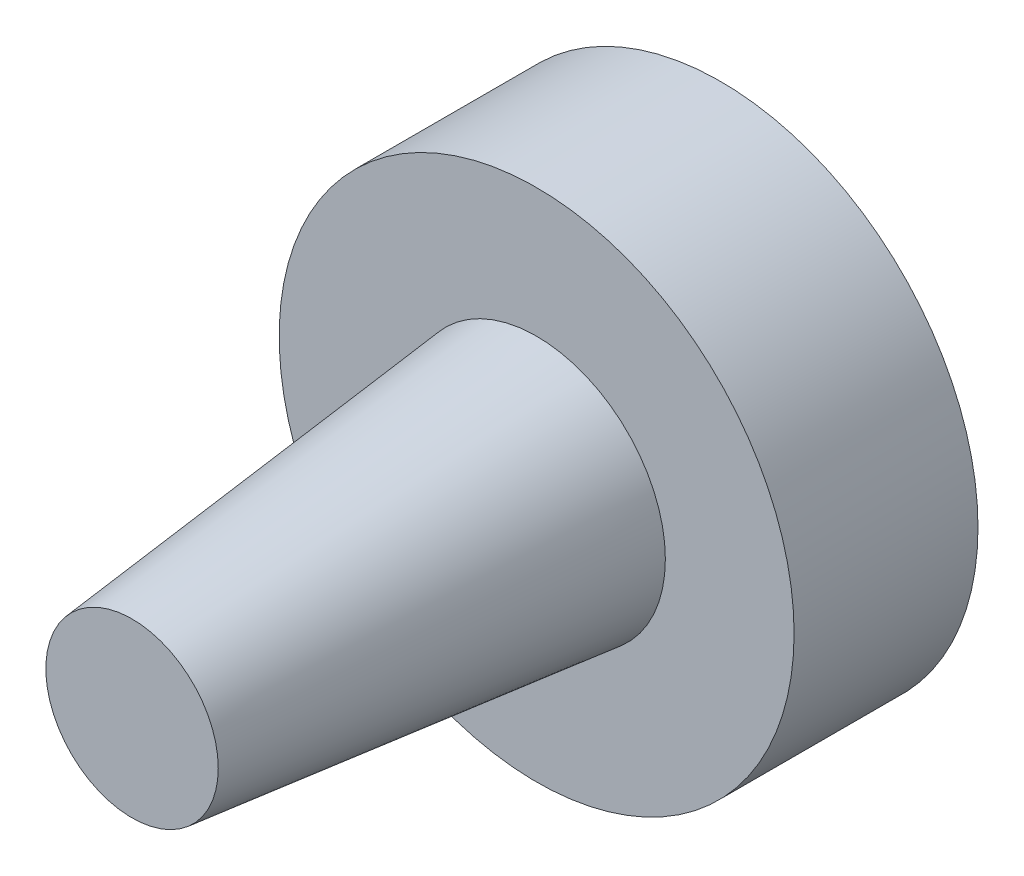
ISO-10303-21;
HEADER;
FILE_DESCRIPTION(('STEP AP214'),'2;1');
FILE_NAME('part.step','',(''),(''),'','','');
FILE_SCHEMA(('AUTOMOTIVE_DESIGN { 1 0 10303 214 1 1 1 1 }'));
ENDSEC;
DATA;
#1=APPLICATION_CONTEXT('core data for automotive mechanical design processes');
#2=APPLICATION_PROTOCOL_DEFINITION('international standard','automotive_design',2000,#1);
#3=PRODUCT_CONTEXT('',#1,'mechanical');
#4=PRODUCT('Part','Part','',(#3));
#5=PRODUCT_RELATED_PRODUCT_CATEGORY('part','',(#4));
#6=PRODUCT_DEFINITION_FORMATION('','',#4);
#7=PRODUCT_DEFINITION_CONTEXT('part definition',#1,'design');
#8=PRODUCT_DEFINITION('design','',#6,#7);
#9=PRODUCT_DEFINITION_SHAPE('','',#8);
#10=(LENGTH_UNIT() NAMED_UNIT(*) SI_UNIT(.MILLI.,.METRE.));
#11=(NAMED_UNIT(*) PLANE_ANGLE_UNIT() SI_UNIT($,.RADIAN.));
#12=(NAMED_UNIT(*) SI_UNIT($,.STERADIAN.) SOLID_ANGLE_UNIT());
#13=UNCERTAINTY_MEASURE_WITH_UNIT(LENGTH_MEASURE(1.E-05),#10,'distance_accuracy_value','');
#14=(GEOMETRIC_REPRESENTATION_CONTEXT(3) GLOBAL_UNCERTAINTY_ASSIGNED_CONTEXT((#13)) GLOBAL_UNIT_ASSIGNED_CONTEXT((#10,
#11,#12)) REPRESENTATION_CONTEXT('',''));
#15=CARTESIAN_POINT('',(0.,0.,0.));
#16=DIRECTION('',(0.,0.,1.));
#17=DIRECTION('',(1.,0.,0.));
#18=AXIS2_PLACEMENT_3D('',#15,#16,#17);
#19=CARTESIAN_POINT('',(0.,0.,5.));
#20=DIRECTION('',(0.,0.,-1.));
#21=DIRECTION('',(-1.,0.,0.));
#22=AXIS2_PLACEMENT_3D('',#19,#20,#21);
#23=CYLINDRICAL_SURFACE('',#22,7.);
#24=CARTESIAN_POINT('',(0.,0.,5.));
#25=DIRECTION('',(0.,0.,1.));
#26=DIRECTION('',(1.,0.,0.));
#27=AXIS2_PLACEMENT_3D('',#24,#25,#26);
#28=CIRCLE('',#27,7.);
#29=CARTESIAN_POINT('',(7.,0.,5.));
#30=VERTEX_POINT('',#29);
#31=EDGE_CURVE('E38',#30,#30,#28,.T.);
#32=ORIENTED_EDGE('',*,*,#31,.F.);
#33=EDGE_LOOP('',(#32));
#34=FACE_BOUND('',#33,.T.);
#35=CARTESIAN_POINT('',(0.,0.,0.));
#36=DIRECTION('',(0.,0.,1.));
#37=DIRECTION('',(1.,0.,0.));
#38=AXIS2_PLACEMENT_3D('',#35,#36,#37);
#39=CIRCLE('',#38,7.);
#40=CARTESIAN_POINT('',(7.,0.,0.));
#41=VERTEX_POINT('',#40);
#42=EDGE_CURVE('E34',#41,#41,#39,.T.);
#43=ORIENTED_EDGE('',*,*,#42,.T.);
#44=EDGE_LOOP('',(#43));
#45=FACE_BOUND('',#44,.T.);
#46=ADVANCED_FACE('F31',(#34,#45),#23,.T.);
#47=CARTESIAN_POINT('',(0.,0.,5.));
#48=DIRECTION('',(0.,0.,1.));
#49=DIRECTION('',(1.,0.,0.));
#50=AXIS2_PLACEMENT_3D('',#47,#48,#49);
#51=PLANE('',#50);
#52=CARTESIAN_POINT('',(0.,0.,5.));
#53=DIRECTION('',(0.,0.,1.));
#54=DIRECTION('',(1.,0.,0.));
#55=AXIS2_PLACEMENT_3D('',#52,#53,#54);
#56=CIRCLE('',#55,3.5);
#57=CARTESIAN_POINT('',(3.5,0.,5.));
#58=VERTEX_POINT('',#57);
#59=EDGE_CURVE('E10',#58,#58,#56,.T.);
#60=ORIENTED_EDGE('',*,*,#59,.F.);
#61=EDGE_LOOP('',(#60));
#62=FACE_BOUND('',#61,.T.);
#63=ORIENTED_EDGE('',*,*,#31,.T.);
#64=EDGE_LOOP('',(#63));
#65=FACE_BOUND('',#64,.T.);
#66=ADVANCED_FACE('F55',(#62,#65),#51,.T.);
#67=CARTESIAN_POINT('',(0.,0.,0.));
#68=DIRECTION('',(0.,0.,1.));
#69=DIRECTION('',(1.,0.,0.));
#70=AXIS2_PLACEMENT_3D('',#67,#68,#69);
#71=PLANE('',#70);
#72=ORIENTED_EDGE('',*,*,#42,.F.);
#73=EDGE_LOOP('',(#72));
#74=FACE_BOUND('',#73,.T.);
#75=ADVANCED_FACE('F52',(#74),#71,.F.);
#76=CARTESIAN_POINT('',(0.,0.,5.));
#77=DIRECTION('',(0.,0.,-1.));
#78=DIRECTION('',(1.,0.,0.));
#79=AXIS2_PLACEMENT_3D('',#76,#77,#78);
#80=CONICAL_SURFACE('',#79,3.5,0.10471975511966);
#81=CARTESIAN_POINT('',(0.,0.,16.));
#82=DIRECTION('',(0.,0.,1.));
#83=DIRECTION('',(1.,0.,0.));
#84=AXIS2_PLACEMENT_3D('',#81,#82,#83);
#85=CIRCLE('',#84,2.34385341207756);
#86=CARTESIAN_POINT('',(2.34385341207756,0.,16.));
#87=VERTEX_POINT('',#86);
#88=EDGE_CURVE('E44',#87,#87,#85,.T.);
#89=ORIENTED_EDGE('',*,*,#88,.F.);
#90=EDGE_LOOP('',(#89));
#91=FACE_BOUND('',#90,.T.);
#92=ORIENTED_EDGE('',*,*,#59,.T.);
#93=EDGE_LOOP('',(#92));
#94=FACE_BOUND('',#93,.T.);
#95=ADVANCED_FACE('F54',(#91,#94),#80,.T.);
#96=CARTESIAN_POINT('',(0.,0.,16.));
#97=DIRECTION('',(0.,0.,1.));
#98=DIRECTION('',(1.,0.,0.));
#99=AXIS2_PLACEMENT_3D('',#96,#97,#98);
#100=PLANE('',#99);
#101=ORIENTED_EDGE('',*,*,#88,.T.);
#102=EDGE_LOOP('',(#101));
#103=FACE_BOUND('',#102,.T.);
#104=ADVANCED_FACE('F60',(#103),#100,.T.);
#105=CLOSED_SHELL('',(#46,#66,#75,#95,#104));
#106=MANIFOLD_SOLID_BREP('B2',#105);
#107=ADVANCED_BREP_SHAPE_REPRESENTATION('',(#18,#106),#14);
#108=SHAPE_DEFINITION_REPRESENTATION(#9,#107);
ENDSEC;
END-ISO-10303-21;
